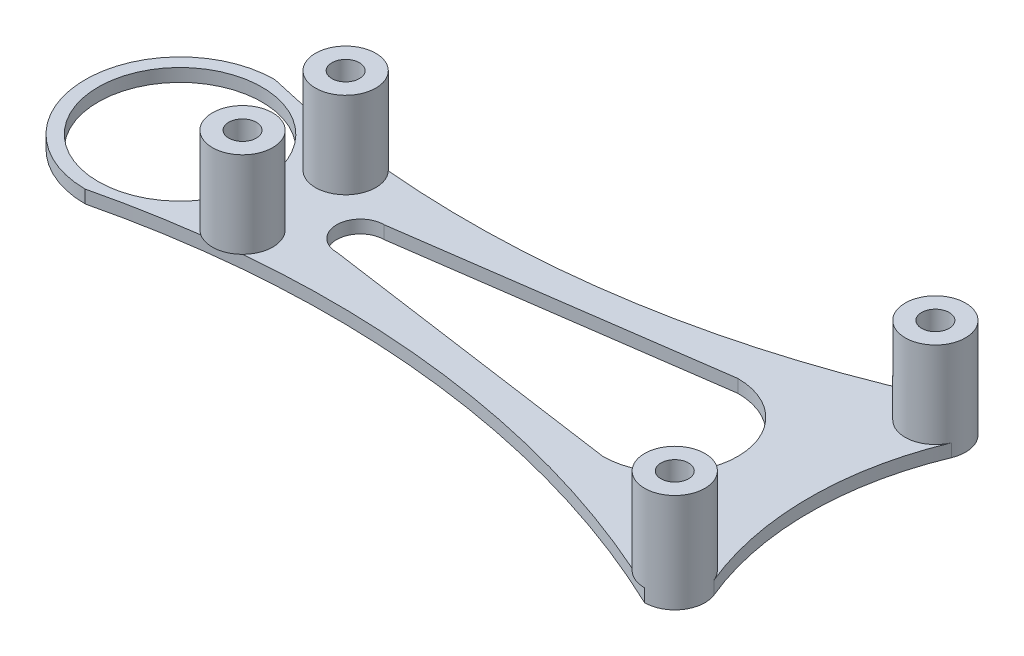
ISO-10303-21;
HEADER;
FILE_DESCRIPTION(('STEP AP214'),'2;1');
FILE_NAME('part.step','',(''),(''),'','','');
FILE_SCHEMA(('AUTOMOTIVE_DESIGN { 1 0 10303 214 1 1 1 1 }'));
ENDSEC;
DATA;
#1=APPLICATION_CONTEXT('core data for automotive mechanical design processes');
#2=APPLICATION_PROTOCOL_DEFINITION('international standard','automotive_design',2000,#1);
#3=PRODUCT_CONTEXT('',#1,'mechanical');
#4=PRODUCT('Part','Part','',(#3));
#5=PRODUCT_RELATED_PRODUCT_CATEGORY('part','',(#4));
#6=PRODUCT_DEFINITION_FORMATION('','',#4);
#7=PRODUCT_DEFINITION_CONTEXT('part definition',#1,'design');
#8=PRODUCT_DEFINITION('design','',#6,#7);
#9=PRODUCT_DEFINITION_SHAPE('','',#8);
#10=(LENGTH_UNIT() NAMED_UNIT(*) SI_UNIT(.MILLI.,.METRE.));
#11=(NAMED_UNIT(*) PLANE_ANGLE_UNIT() SI_UNIT($,.RADIAN.));
#12=(NAMED_UNIT(*) SI_UNIT($,.STERADIAN.) SOLID_ANGLE_UNIT());
#13=UNCERTAINTY_MEASURE_WITH_UNIT(LENGTH_MEASURE(1.E-05),#10,'distance_accuracy_value','');
#14=(GEOMETRIC_REPRESENTATION_CONTEXT(3) GLOBAL_UNCERTAINTY_ASSIGNED_CONTEXT((#13)) GLOBAL_UNIT_ASSIGNED_CONTEXT((#10,
#11,#12)) REPRESENTATION_CONTEXT('',''));
#15=CARTESIAN_POINT('',(0.,0.,0.));
#16=DIRECTION('',(0.,0.,1.));
#17=DIRECTION('',(1.,0.,0.));
#18=AXIS2_PLACEMENT_3D('',#15,#16,#17);
#19=CARTESIAN_POINT('',(-18.246620767098,0.75,7.55799778921041));
#20=DIRECTION('',(0.,1.,0.));
#21=DIRECTION('',(0.,0.,1.));
#22=AXIS2_PLACEMENT_3D('',#19,#20,#21);
#23=PLANE('',#22);
#24=CARTESIAN_POINT('',(-109.,0.75,0.));
#25=DIRECTION('',(0.,1.,0.));
#26=DIRECTION('',(0.,0.,1.));
#27=AXIS2_PLACEMENT_3D('',#24,#25,#26);
#28=CIRCLE('',#27,9.49999999999999);
#29=CARTESIAN_POINT('',(-109.,0.75,9.49999999999999));
#30=VERTEX_POINT('',#29);
#31=EDGE_CURVE('E253',#30,#30,#28,.T.);
#32=ORIENTED_EDGE('',*,*,#31,.F.);
#33=EDGE_LOOP('',(#32));
#34=FACE_BOUND('',#33,.T.);
#35=CARTESIAN_POINT('',(-88.0784459485142,0.75,0.));
#36=DIRECTION('',(0.,1.,0.));
#37=DIRECTION('',(0.,0.,1.));
#38=AXIS2_PLACEMENT_3D('',#35,#36,#37);
#39=CIRCLE('',#38,2.75757742414673);
#40=CARTESIAN_POINT('',(-88.0784459485142,0.75,-2.75757742414675));
#41=VERTEX_POINT('',#40);
#42=CARTESIAN_POINT('',(-88.0784459485142,0.75,2.75757742414671));
#43=VERTEX_POINT('',#42);
#44=EDGE_CURVE('E277',#41,#43,#39,.T.);
#45=ORIENTED_EDGE('',*,*,#44,.F.);
#46=DIRECTION('',(-0.990191024034519,0.,0.139720205845361));
#47=VECTOR('',#46,1.);
#48=CARTESIAN_POINT('',(-88.0784459485142,0.75,-2.75757742414675));
#49=LINE('',#48,#47);
#50=CARTESIAN_POINT('',(-52.1196363376409,0.75,-7.83151988457672));
#51=VERTEX_POINT('',#50);
#52=EDGE_CURVE('E264',#51,#41,#49,.T.);
#53=ORIENTED_EDGE('',*,*,#52,.F.);
#54=CARTESIAN_POINT('',(-52.1196363376409,0.75,0.));
#55=DIRECTION('',(0.,1.,0.));
#56=DIRECTION('',(0.,0.,1.));
#57=AXIS2_PLACEMENT_3D('',#54,#55,#56);
#58=CIRCLE('',#57,7.8315198845767);
#59=CARTESIAN_POINT('',(-52.1196363376409,0.75,7.83151988457668));
#60=VERTEX_POINT('',#59);
#61=EDGE_CURVE('E271',#60,#51,#58,.T.);
#62=ORIENTED_EDGE('',*,*,#61,.F.);
#63=DIRECTION('',(0.990191024034519,0.,0.139720205845361));
#64=VECTOR('',#63,1.);
#65=CARTESIAN_POINT('',(-88.0784459485142,0.75,2.75757742414671));
#66=LINE('',#65,#64);
#67=EDGE_CURVE('E274',#43,#60,#66,.T.);
#68=ORIENTED_EDGE('',*,*,#67,.F.);
#69=EDGE_LOOP('',(#45,#53,#62,#68));
#70=FACE_BOUND('',#69,.T.);
#71=CARTESIAN_POINT('',(-83.4775380681395,0.75,-116.969825596425));
#72=DIRECTION('',(0.,-1.,0.));
#73=DIRECTION('',(0.,0.,1.));
#74=AXIS2_PLACEMENT_3D('',#71,#72,#73);
#75=CIRCLE('',#74,109.);
#76=CARTESIAN_POINT('',(-39.1557309026529,0.75,-17.3878121121345));
#77=VERTEX_POINT('',#76);
#78=CARTESIAN_POINT('',(-93.2508303405097,0.75,-8.40886227093295));
#79=VERTEX_POINT('',#78);
#80=EDGE_CURVE('E138',#77,#79,#75,.T.);
#81=ORIENTED_EDGE('',*,*,#80,.T.);
#82=CARTESIAN_POINT('',(-95.79,0.75,-6.));
#83=DIRECTION('',(0.,1.,0.));
#84=DIRECTION('',(0.,0.,1.));
#85=AXIS2_PLACEMENT_3D('',#82,#83,#84);
#86=CIRCLE('',#85,3.50000000000001);
#87=CARTESIAN_POINT('',(-97.7393707773299,0.75,-8.90688038496468));
#88=VERTEX_POINT('',#87);
#89=EDGE_CURVE('E141',#88,#79,#86,.T.);
#90=ORIENTED_EDGE('',*,*,#89,.F.);
#91=CARTESIAN_POINT('',(-109.,0.75,-11.));
#92=VERTEX_POINT('',#91);
#93=EDGE_CURVE('E131',#88,#92,#75,.T.);
#94=ORIENTED_EDGE('',*,*,#93,.T.);
#95=CARTESIAN_POINT('',(-109.,0.75,0.));
#96=DIRECTION('',(0.,1.,0.));
#97=DIRECTION('',(0.,0.,1.));
#98=AXIS2_PLACEMENT_3D('',#95,#96,#97);
#99=CIRCLE('',#98,11.);
#100=CARTESIAN_POINT('',(-109.,0.75,11.));
#101=VERTEX_POINT('',#100);
#102=EDGE_CURVE('E236',#92,#101,#99,.T.);
#103=ORIENTED_EDGE('',*,*,#102,.T.);
#104=CARTESIAN_POINT('',(-83.4775380681395,0.75,116.969825596425));
#105=DIRECTION('',(0.,-1.,0.));
#106=DIRECTION('',(0.,0.,-1.));
#107=AXIS2_PLACEMENT_3D('',#104,#105,#106);
#108=CIRCLE('',#107,109.);
#109=CARTESIAN_POINT('',(-97.6887289545401,0.75,8.90020889686283));
#110=VERTEX_POINT('',#109);
#111=EDGE_CURVE('E219',#101,#110,#108,.T.);
#112=ORIENTED_EDGE('',*,*,#111,.T.);
#113=CARTESIAN_POINT('',(-95.79,0.75,5.96));
#114=DIRECTION('',(0.,1.,0.));
#115=DIRECTION('',(0.,0.,1.));
#116=AXIS2_PLACEMENT_3D('',#113,#114,#115);
#117=CIRCLE('',#116,3.50000000000001);
#118=CARTESIAN_POINT('',(-93.2931283109779,0.75,8.41267848862423));
#119=VERTEX_POINT('',#118);
#120=EDGE_CURVE('E164',#119,#110,#117,.T.);
#121=ORIENTED_EDGE('',*,*,#120,.F.);
#122=CARTESIAN_POINT('',(-39.1557309026526,0.75,17.3878121121346));
#123=VERTEX_POINT('',#122);
#124=EDGE_CURVE('E235',#119,#123,#108,.T.);
#125=ORIENTED_EDGE('',*,*,#124,.T.);
#126=CARTESIAN_POINT('',(-36.4932415341959,0.75,15.1159955784208));
#127=DIRECTION('',(0.,1.,0.));
#128=DIRECTION('',(0.,0.,1.));
#129=AXIS2_PLACEMENT_3D('',#126,#127,#128);
#130=CIRCLE('',#129,3.5);
#131=CARTESIAN_POINT('',(-33.2596631704064,0.75,13.776603565143));
#132=VERTEX_POINT('',#131);
#133=EDGE_CURVE('E176',#132,#123,#130,.T.);
#134=ORIENTED_EDGE('',*,*,#133,.F.);
#135=CARTESIAN_POINT('',(0.,0.75,0.));
#136=DIRECTION('',(0.,-1.,0.));
#137=DIRECTION('',(0.,0.,1.));
#138=AXIS2_PLACEMENT_3D('',#135,#136,#137);
#139=CIRCLE('',#138,36.);
#140=CARTESIAN_POINT('',(-33.2596631704064,0.75,-13.776603565143));
#141=VERTEX_POINT('',#140);
#142=EDGE_CURVE('E139',#132,#141,#139,.T.);
#143=ORIENTED_EDGE('',*,*,#142,.T.);
#144=CARTESIAN_POINT('',(-36.4932415341959,0.75,-15.1159955784208));
#145=DIRECTION('',(0.,1.,0.));
#146=DIRECTION('',(0.,0.,1.));
#147=AXIS2_PLACEMENT_3D('',#144,#145,#146);
#148=CIRCLE('',#147,3.5);
#149=EDGE_CURVE('E11',#77,#141,#148,.T.);
#150=ORIENTED_EDGE('',*,*,#149,.F.);
#151=EDGE_LOOP('',(#81,#90,#94,#103,#112,#121,#125,#134,#143,#150));
#152=FACE_BOUND('',#151,.T.);
#153=ADVANCED_FACE('F33',(#34,#70,#152),#23,.T.);
#154=CARTESIAN_POINT('',(-18.246620767098,-0.75,7.55799778921041));
#155=DIRECTION('',(0.,1.,0.));
#156=DIRECTION('',(0.,0.,1.));
#157=AXIS2_PLACEMENT_3D('',#154,#155,#156);
#158=PLANE('',#157);
#159=DIRECTION('',(0.990191024034519,0.,-0.139720205845361));
#160=VECTOR('',#159,1.);
#161=CARTESIAN_POINT('',(-88.0784459485142,-0.75,-2.75757742414675));
#162=LINE('',#161,#160);
#163=CARTESIAN_POINT('',(-88.0784459485142,-0.75,-2.75757742414675));
#164=VERTEX_POINT('',#163);
#165=CARTESIAN_POINT('',(-52.1196363376409,-0.75,-7.83151988457672));
#166=VERTEX_POINT('',#165);
#167=EDGE_CURVE('E281',#164,#166,#162,.T.);
#168=ORIENTED_EDGE('',*,*,#167,.F.);
#169=CARTESIAN_POINT('',(-88.0784459485142,-0.75,0.));
#170=DIRECTION('',(0.,1.,0.));
#171=DIRECTION('',(0.,0.,1.));
#172=AXIS2_PLACEMENT_3D('',#169,#170,#171);
#173=CIRCLE('',#172,2.75757742414673);
#174=CARTESIAN_POINT('',(-88.0784459485142,-0.75,2.75757742414671));
#175=VERTEX_POINT('',#174);
#176=EDGE_CURVE('E279',#175,#164,#173,.F.);
#177=ORIENTED_EDGE('',*,*,#176,.F.);
#178=DIRECTION('',(-0.990191024034519,0.,-0.139720205845361));
#179=VECTOR('',#178,1.);
#180=CARTESIAN_POINT('',(-88.0784459485142,-0.75,2.75757742414671));
#181=LINE('',#180,#179);
#182=CARTESIAN_POINT('',(-52.1196363376409,-0.75,7.83151988457668));
#183=VERTEX_POINT('',#182);
#184=EDGE_CURVE('E256',#183,#175,#181,.T.);
#185=ORIENTED_EDGE('',*,*,#184,.F.);
#186=CARTESIAN_POINT('',(-52.1196363376409,-0.75,0.));
#187=DIRECTION('',(0.,1.,0.));
#188=DIRECTION('',(0.,0.,1.));
#189=AXIS2_PLACEMENT_3D('',#186,#187,#188);
#190=CIRCLE('',#189,7.8315198845767);
#191=EDGE_CURVE('E188',#166,#183,#190,.F.);
#192=ORIENTED_EDGE('',*,*,#191,.F.);
#193=EDGE_LOOP('',(#168,#177,#185,#192));
#194=FACE_BOUND('',#193,.T.);
#195=CARTESIAN_POINT('',(-109.,-0.75,0.));
#196=DIRECTION('',(0.,1.,0.));
#197=DIRECTION('',(0.,0.,1.));
#198=AXIS2_PLACEMENT_3D('',#195,#196,#197);
#199=CIRCLE('',#198,9.49999999999999);
#200=CARTESIAN_POINT('',(-109.,-0.75,9.49999999999999));
#201=VERTEX_POINT('',#200);
#202=EDGE_CURVE('E250',#201,#201,#199,.F.);
#203=ORIENTED_EDGE('',*,*,#202,.F.);
#204=EDGE_LOOP('',(#203));
#205=FACE_BOUND('',#204,.T.);
#206=CARTESIAN_POINT('',(-95.79,-0.75,5.96));
#207=DIRECTION('',(0.,1.,0.));
#208=DIRECTION('',(0.,0.,1.));
#209=AXIS2_PLACEMENT_3D('',#206,#207,#208);
#210=CIRCLE('',#209,1.60000000000001);
#211=CARTESIAN_POINT('',(-95.79,-0.75,7.56));
#212=VERTEX_POINT('',#211);
#213=EDGE_CURVE('E244',#212,#212,#210,.T.);
#214=ORIENTED_EDGE('',*,*,#213,.T.);
#215=EDGE_LOOP('',(#214));
#216=FACE_BOUND('',#215,.T.);
#217=CARTESIAN_POINT('',(-36.4932415341959,-0.75,-15.1159955784208));
#218=DIRECTION('',(0.,1.,0.));
#219=DIRECTION('',(0.,0.,1.));
#220=AXIS2_PLACEMENT_3D('',#217,#218,#219);
#221=CIRCLE('',#220,1.6);
#222=CARTESIAN_POINT('',(-36.4932415341959,-0.75,-13.5159955784208));
#223=VERTEX_POINT('',#222);
#224=EDGE_CURVE('E233',#223,#223,#221,.T.);
#225=ORIENTED_EDGE('',*,*,#224,.T.);
#226=EDGE_LOOP('',(#225));
#227=FACE_BOUND('',#226,.T.);
#228=CARTESIAN_POINT('',(-36.4932415341959,-0.75,15.1159955784208));
#229=DIRECTION('',(0.,1.,0.));
#230=DIRECTION('',(0.,0.,1.));
#231=AXIS2_PLACEMENT_3D('',#228,#229,#230);
#232=CIRCLE('',#231,3.50000000000001);
#233=CARTESIAN_POINT('',(-36.4932415341959,-0.75,18.6159955784208));
#234=VERTEX_POINT('',#233);
#235=CARTESIAN_POINT('',(-33.2596631704064,-0.75,13.776603565143));
#236=VERTEX_POINT('',#235);
#237=EDGE_CURVE('E230',#234,#236,#232,.T.);
#238=ORIENTED_EDGE('',*,*,#237,.F.);
#239=CARTESIAN_POINT('',(-83.4775380681395,-0.75,116.969825596425));
#240=DIRECTION('',(0.,-1.,0.));
#241=DIRECTION('',(0.,0.,-1.));
#242=AXIS2_PLACEMENT_3D('',#239,#240,#241);
#243=CIRCLE('',#242,109.);
#244=CARTESIAN_POINT('',(-109.,-0.75,11.));
#245=VERTEX_POINT('',#244);
#246=EDGE_CURVE('E220',#245,#234,#243,.T.);
#247=ORIENTED_EDGE('',*,*,#246,.F.);
#248=CARTESIAN_POINT('',(-109.,-0.75,0.));
#249=DIRECTION('',(0.,1.,0.));
#250=DIRECTION('',(0.,0.,1.));
#251=AXIS2_PLACEMENT_3D('',#248,#249,#250);
#252=CIRCLE('',#251,11.);
#253=CARTESIAN_POINT('',(-109.,-0.75,-11.));
#254=VERTEX_POINT('',#253);
#255=EDGE_CURVE('E222',#254,#245,#252,.T.);
#256=ORIENTED_EDGE('',*,*,#255,.F.);
#257=CARTESIAN_POINT('',(-83.4775380681395,-0.75,-116.969825596425));
#258=DIRECTION('',(0.,-1.,0.));
#259=DIRECTION('',(0.,0.,1.));
#260=AXIS2_PLACEMENT_3D('',#257,#258,#259);
#261=CIRCLE('',#260,109.);
#262=CARTESIAN_POINT('',(-36.4932415341959,-0.75,-18.6159955784208));
#263=VERTEX_POINT('',#262);
#264=EDGE_CURVE('E224',#263,#254,#261,.T.);
#265=ORIENTED_EDGE('',*,*,#264,.F.);
#266=CARTESIAN_POINT('',(-36.4932415341959,-0.75,-15.1159955784208));
#267=DIRECTION('',(0.,1.,0.));
#268=DIRECTION('',(0.,0.,1.));
#269=AXIS2_PLACEMENT_3D('',#266,#267,#268);
#270=CIRCLE('',#269,3.5);
#271=CARTESIAN_POINT('',(-33.2596631704064,-0.75,-13.776603565143));
#272=VERTEX_POINT('',#271);
#273=EDGE_CURVE('E226',#272,#263,#270,.T.);
#274=ORIENTED_EDGE('',*,*,#273,.F.);
#275=CARTESIAN_POINT('',(0.,-0.75,0.));
#276=DIRECTION('',(0.,-1.,0.));
#277=DIRECTION('',(0.,0.,1.));
#278=AXIS2_PLACEMENT_3D('',#275,#276,#277);
#279=CIRCLE('',#278,36.);
#280=EDGE_CURVE('E228',#236,#272,#279,.T.);
#281=ORIENTED_EDGE('',*,*,#280,.F.);
#282=EDGE_LOOP('',(#238,#247,#256,#265,#274,#281));
#283=FACE_BOUND('',#282,.T.);
#284=CARTESIAN_POINT('',(-36.4932415341959,-0.75,15.1159955784208));
#285=DIRECTION('',(0.,1.,0.));
#286=DIRECTION('',(0.,0.,1.));
#287=AXIS2_PLACEMENT_3D('',#284,#285,#286);
#288=CIRCLE('',#287,1.6);
#289=CARTESIAN_POINT('',(-36.4932415341959,-0.75,16.7159955784208));
#290=VERTEX_POINT('',#289);
#291=EDGE_CURVE('E241',#290,#290,#288,.T.);
#292=ORIENTED_EDGE('',*,*,#291,.T.);
#293=EDGE_LOOP('',(#292));
#294=FACE_BOUND('',#293,.T.);
#295=CARTESIAN_POINT('',(-95.79,-0.75,-6.));
#296=DIRECTION('',(0.,1.,0.));
#297=DIRECTION('',(0.,0.,1.));
#298=AXIS2_PLACEMENT_3D('',#295,#296,#297);
#299=CIRCLE('',#298,1.60000000000001);
#300=CARTESIAN_POINT('',(-95.79,-0.75,-4.4));
#301=VERTEX_POINT('',#300);
#302=EDGE_CURVE('E247',#301,#301,#299,.T.);
#303=ORIENTED_EDGE('',*,*,#302,.T.);
#304=EDGE_LOOP('',(#303));
#305=FACE_BOUND('',#304,.T.);
#306=ADVANCED_FACE('F296',(#194,#205,#216,#227,#283,#294,#305),#158,.F.);
#307=CARTESIAN_POINT('',(-36.4932415341959,0.75,15.1159955784208));
#308=DIRECTION('',(0.,-1.,0.));
#309=DIRECTION('',(0.,0.,-1.));
#310=AXIS2_PLACEMENT_3D('',#307,#308,#309);
#311=CYLINDRICAL_SURFACE('',#310,3.50000000000001);
#312=ORIENTED_EDGE('',*,*,#237,.T.);
#313=DIRECTION('',(0.,-1.,0.));
#314=VECTOR('',#313,1.);
#315=CARTESIAN_POINT('',(-33.2596631704064,0.75,13.776603565143));
#316=LINE('',#315,#314);
#317=EDGE_CURVE('E43',#132,#236,#316,.T.);
#318=ORIENTED_EDGE('',*,*,#317,.F.);
#319=ORIENTED_EDGE('',*,*,#133,.T.);
#320=CARTESIAN_POINT('',(-36.4932415341959,0.75,18.6159955784208));
#321=VERTEX_POINT('',#320);
#322=EDGE_CURVE('E171',#123,#321,#130,.T.);
#323=ORIENTED_EDGE('',*,*,#322,.T.);
#324=DIRECTION('',(0.,-1.,0.));
#325=VECTOR('',#324,1.);
#326=CARTESIAN_POINT('',(-36.4932415341959,0.75,18.6159955784208));
#327=LINE('',#326,#325);
#328=EDGE_CURVE('E214',#321,#234,#327,.T.);
#329=ORIENTED_EDGE('',*,*,#328,.T.);
#330=EDGE_LOOP('',(#312,#318,#319,#323,#329));
#331=FACE_BOUND('',#330,.T.);
#332=CARTESIAN_POINT('',(-36.4932415341959,10.75,15.1159955784208));
#333=DIRECTION('',(0.,1.,0.));
#334=DIRECTION('',(0.,0.,1.));
#335=AXIS2_PLACEMENT_3D('',#332,#333,#334);
#336=CIRCLE('',#335,3.5);
#337=CARTESIAN_POINT('',(-36.4932415341959,10.75,18.6159955784208));
#338=VERTEX_POINT('',#337);
#339=EDGE_CURVE('E172',#338,#338,#336,.T.);
#340=ORIENTED_EDGE('',*,*,#339,.F.);
#341=EDGE_LOOP('',(#340));
#342=FACE_BOUND('',#341,.T.);
#343=ADVANCED_FACE('F35',(#331,#342),#311,.T.);
#344=CARTESIAN_POINT('',(0.,0.75,0.));
#345=DIRECTION('',(0.,-1.,0.));
#346=DIRECTION('',(0.,0.,-1.));
#347=AXIS2_PLACEMENT_3D('',#344,#345,#346);
#348=CYLINDRICAL_SURFACE('',#347,36.);
#349=ORIENTED_EDGE('',*,*,#280,.T.);
#350=DIRECTION('',(0.,-1.,0.));
#351=VECTOR('',#350,1.);
#352=CARTESIAN_POINT('',(-33.2596631704064,0.75,-13.776603565143));
#353=LINE('',#352,#351);
#354=EDGE_CURVE('E197',#141,#272,#353,.T.);
#355=ORIENTED_EDGE('',*,*,#354,.F.);
#356=ORIENTED_EDGE('',*,*,#142,.F.);
#357=ORIENTED_EDGE('',*,*,#317,.T.);
#358=EDGE_LOOP('',(#349,#355,#356,#357));
#359=FACE_BOUND('',#358,.T.);
#360=ADVANCED_FACE('F338',(#359),#348,.F.);
#361=CARTESIAN_POINT('',(-36.4932415341959,0.75,-15.1159955784208));
#362=DIRECTION('',(0.,-1.,0.));
#363=DIRECTION('',(0.,0.,-1.));
#364=AXIS2_PLACEMENT_3D('',#361,#362,#363);
#365=CYLINDRICAL_SURFACE('',#364,3.5);
#366=ORIENTED_EDGE('',*,*,#273,.T.);
#367=DIRECTION('',(0.,-1.,0.));
#368=VECTOR('',#367,1.);
#369=CARTESIAN_POINT('',(-36.4932415341959,0.75,-18.6159955784208));
#370=LINE('',#369,#368);
#371=CARTESIAN_POINT('',(-36.4932415341959,0.75,-18.6159955784208));
#372=VERTEX_POINT('',#371);
#373=EDGE_CURVE('E204',#372,#263,#370,.T.);
#374=ORIENTED_EDGE('',*,*,#373,.F.);
#375=EDGE_CURVE('E184',#372,#77,#148,.T.);
#376=ORIENTED_EDGE('',*,*,#375,.T.);
#377=ORIENTED_EDGE('',*,*,#149,.T.);
#378=ORIENTED_EDGE('',*,*,#354,.T.);
#379=EDGE_LOOP('',(#366,#374,#376,#377,#378));
#380=FACE_BOUND('',#379,.T.);
#381=CARTESIAN_POINT('',(-36.4932415341959,10.75,-15.1159955784208));
#382=DIRECTION('',(0.,1.,0.));
#383=DIRECTION('',(0.,0.,1.));
#384=AXIS2_PLACEMENT_3D('',#381,#382,#383);
#385=CIRCLE('',#384,3.5);
#386=CARTESIAN_POINT('',(-36.4932415341959,10.75,-11.6159955784208));
#387=VERTEX_POINT('',#386);
#388=EDGE_CURVE('E185',#387,#387,#385,.T.);
#389=ORIENTED_EDGE('',*,*,#388,.F.);
#390=EDGE_LOOP('',(#389));
#391=FACE_BOUND('',#390,.T.);
#392=ADVANCED_FACE('F336',(#380,#391),#365,.T.);
#393=CARTESIAN_POINT('',(-83.4775380681395,0.75,-116.969825596425));
#394=DIRECTION('',(0.,-1.,0.));
#395=DIRECTION('',(0.,0.,-1.));
#396=AXIS2_PLACEMENT_3D('',#393,#394,#395);
#397=CYLINDRICAL_SURFACE('',#396,109.);
#398=ORIENTED_EDGE('',*,*,#264,.T.);
#399=DIRECTION('',(0.,-1.,0.));
#400=VECTOR('',#399,1.);
#401=CARTESIAN_POINT('',(-109.,0.75,-11.));
#402=LINE('',#401,#400);
#403=EDGE_CURVE('E135',#92,#254,#402,.T.);
#404=ORIENTED_EDGE('',*,*,#403,.F.);
#405=ORIENTED_EDGE('',*,*,#93,.F.);
#406=CARTESIAN_POINT('',(-83.4775380681395,0.75,-116.969825596425));
#407=DIRECTION('',(0.,1.,0.));
#408=DIRECTION('',(0.,0.,1.));
#409=AXIS2_PLACEMENT_3D('',#406,#407,#408);
#410=CIRCLE('',#409,109.);
#411=EDGE_CURVE('E51',#79,#88,#410,.F.);
#412=ORIENTED_EDGE('',*,*,#411,.F.);
#413=ORIENTED_EDGE('',*,*,#80,.F.);
#414=EDGE_CURVE('E37',#372,#77,#75,.T.);
#415=ORIENTED_EDGE('',*,*,#414,.F.);
#416=ORIENTED_EDGE('',*,*,#373,.T.);
#417=EDGE_LOOP('',(#398,#404,#405,#412,#413,#415,#416));
#418=FACE_BOUND('',#417,.T.);
#419=ADVANCED_FACE('F133',(#418),#397,.F.);
#420=CARTESIAN_POINT('',(-109.,0.75,0.));
#421=DIRECTION('',(0.,-1.,0.));
#422=DIRECTION('',(0.,0.,-1.));
#423=AXIS2_PLACEMENT_3D('',#420,#421,#422);
#424=CYLINDRICAL_SURFACE('',#423,11.);
#425=ORIENTED_EDGE('',*,*,#255,.T.);
#426=DIRECTION('',(0.,-1.,0.));
#427=VECTOR('',#426,1.);
#428=CARTESIAN_POINT('',(-109.,0.75,11.));
#429=LINE('',#428,#427);
#430=EDGE_CURVE('E210',#101,#245,#429,.T.);
#431=ORIENTED_EDGE('',*,*,#430,.F.);
#432=ORIENTED_EDGE('',*,*,#102,.F.);
#433=ORIENTED_EDGE('',*,*,#403,.T.);
#434=EDGE_LOOP('',(#425,#431,#432,#433));
#435=FACE_BOUND('',#434,.T.);
#436=ADVANCED_FACE('F331',(#435),#424,.T.);
#437=CARTESIAN_POINT('',(-83.4775380681395,0.75,116.969825596425));
#438=DIRECTION('',(0.,-1.,0.));
#439=DIRECTION('',(0.,0.,-1.));
#440=AXIS2_PLACEMENT_3D('',#437,#438,#439);
#441=CYLINDRICAL_SURFACE('',#440,109.);
#442=ORIENTED_EDGE('',*,*,#246,.T.);
#443=ORIENTED_EDGE('',*,*,#328,.F.);
#444=CARTESIAN_POINT('',(-83.4775380681395,0.75,116.969825596425));
#445=DIRECTION('',(0.,1.,0.));
#446=DIRECTION('',(0.,0.,1.));
#447=AXIS2_PLACEMENT_3D('',#444,#445,#446);
#448=CIRCLE('',#447,109.);
#449=EDGE_CURVE('E175',#123,#321,#448,.F.);
#450=ORIENTED_EDGE('',*,*,#449,.F.);
#451=ORIENTED_EDGE('',*,*,#124,.F.);
#452=CARTESIAN_POINT('',(-83.4775380681395,0.75,116.969825596425));
#453=DIRECTION('',(0.,1.,0.));
#454=DIRECTION('',(0.,0.,1.));
#455=AXIS2_PLACEMENT_3D('',#452,#453,#454);
#456=CIRCLE('',#455,109.);
#457=EDGE_CURVE('E59',#110,#119,#456,.F.);
#458=ORIENTED_EDGE('',*,*,#457,.F.);
#459=ORIENTED_EDGE('',*,*,#111,.F.);
#460=ORIENTED_EDGE('',*,*,#430,.T.);
#461=EDGE_LOOP('',(#442,#443,#450,#451,#458,#459,#460));
#462=FACE_BOUND('',#461,.T.);
#463=ADVANCED_FACE('F328',(#462),#441,.F.);
#464=CARTESIAN_POINT('',(-36.4932415341959,0.75,-15.1159955784208));
#465=DIRECTION('',(0.,-1.,0.));
#466=DIRECTION('',(0.,0.,-1.));
#467=AXIS2_PLACEMENT_3D('',#464,#465,#466);
#468=CYLINDRICAL_SURFACE('',#467,1.6);
#469=ORIENTED_EDGE('',*,*,#224,.F.);
#470=EDGE_LOOP('',(#469));
#471=FACE_BOUND('',#470,.T.);
#472=CARTESIAN_POINT('',(-36.4932415341959,10.75,-15.1159955784208));
#473=DIRECTION('',(0.,1.,0.));
#474=DIRECTION('',(0.,0.,1.));
#475=AXIS2_PLACEMENT_3D('',#472,#473,#474);
#476=CIRCLE('',#475,1.6);
#477=CARTESIAN_POINT('',(-36.4932415341959,10.75,-13.5159955784208));
#478=VERTEX_POINT('',#477);
#479=EDGE_CURVE('E181',#478,#478,#476,.T.);
#480=ORIENTED_EDGE('',*,*,#479,.T.);
#481=EDGE_LOOP('',(#480));
#482=FACE_BOUND('',#481,.T.);
#483=ADVANCED_FACE('F325',(#471,#482),#468,.F.);
#484=CARTESIAN_POINT('',(-36.4932415341959,0.75,15.1159955784208));
#485=DIRECTION('',(0.,-1.,0.));
#486=DIRECTION('',(0.,0.,-1.));
#487=AXIS2_PLACEMENT_3D('',#484,#485,#486);
#488=CYLINDRICAL_SURFACE('',#487,1.6);
#489=ORIENTED_EDGE('',*,*,#291,.F.);
#490=EDGE_LOOP('',(#489));
#491=FACE_BOUND('',#490,.T.);
#492=CARTESIAN_POINT('',(-36.4932415341959,10.75,15.1159955784208));
#493=DIRECTION('',(0.,1.,0.));
#494=DIRECTION('',(0.,0.,1.));
#495=AXIS2_PLACEMENT_3D('',#492,#493,#494);
#496=CIRCLE('',#495,1.6);
#497=CARTESIAN_POINT('',(-36.4932415341959,10.75,16.7159955784208));
#498=VERTEX_POINT('',#497);
#499=EDGE_CURVE('E168',#498,#498,#496,.T.);
#500=ORIENTED_EDGE('',*,*,#499,.T.);
#501=EDGE_LOOP('',(#500));
#502=FACE_BOUND('',#501,.T.);
#503=ADVANCED_FACE('F412',(#491,#502),#488,.F.);
#504=CARTESIAN_POINT('',(-95.79,0.75,5.96));
#505=DIRECTION('',(0.,-1.,0.));
#506=DIRECTION('',(0.,0.,-1.));
#507=AXIS2_PLACEMENT_3D('',#504,#505,#506);
#508=CYLINDRICAL_SURFACE('',#507,1.60000000000001);
#509=ORIENTED_EDGE('',*,*,#213,.F.);
#510=EDGE_LOOP('',(#509));
#511=FACE_BOUND('',#510,.T.);
#512=CARTESIAN_POINT('',(-95.79,10.75,5.96));
#513=DIRECTION('',(0.,1.,0.));
#514=DIRECTION('',(0.,0.,1.));
#515=AXIS2_PLACEMENT_3D('',#512,#513,#514);
#516=CIRCLE('',#515,1.60000000000001);
#517=CARTESIAN_POINT('',(-95.79,10.75,7.56000000000001));
#518=VERTEX_POINT('',#517);
#519=EDGE_CURVE('E150',#518,#518,#516,.T.);
#520=ORIENTED_EDGE('',*,*,#519,.T.);
#521=EDGE_LOOP('',(#520));
#522=FACE_BOUND('',#521,.T.);
#523=ADVANCED_FACE('F409',(#511,#522),#508,.F.);
#524=CARTESIAN_POINT('',(-95.79,0.75,-6.));
#525=DIRECTION('',(0.,-1.,0.));
#526=DIRECTION('',(0.,0.,-1.));
#527=AXIS2_PLACEMENT_3D('',#524,#525,#526);
#528=CYLINDRICAL_SURFACE('',#527,1.60000000000001);
#529=ORIENTED_EDGE('',*,*,#302,.F.);
#530=EDGE_LOOP('',(#529));
#531=FACE_BOUND('',#530,.T.);
#532=CARTESIAN_POINT('',(-95.79,10.75,-6.));
#533=DIRECTION('',(0.,1.,0.));
#534=DIRECTION('',(0.,0.,1.));
#535=AXIS2_PLACEMENT_3D('',#532,#533,#534);
#536=CIRCLE('',#535,1.60000000000001);
#537=CARTESIAN_POINT('',(-95.79,10.75,-4.4));
#538=VERTEX_POINT('',#537);
#539=EDGE_CURVE('E146',#538,#538,#536,.T.);
#540=ORIENTED_EDGE('',*,*,#539,.T.);
#541=EDGE_LOOP('',(#540));
#542=FACE_BOUND('',#541,.T.);
#543=ADVANCED_FACE('F406',(#531,#542),#528,.F.);
#544=CARTESIAN_POINT('',(-109.,-0.751,0.));
#545=DIRECTION('',(0.,1.,0.));
#546=DIRECTION('',(0.,0.,1.));
#547=AXIS2_PLACEMENT_3D('',#544,#545,#546);
#548=CYLINDRICAL_SURFACE('',#547,9.49999999999999);
#549=ORIENTED_EDGE('',*,*,#31,.T.);
#550=EDGE_LOOP('',(#549));
#551=FACE_BOUND('',#550,.T.);
#552=ORIENTED_EDGE('',*,*,#202,.T.);
#553=EDGE_LOOP('',(#552));
#554=FACE_BOUND('',#553,.T.);
#555=ADVANCED_FACE('F311',(#551,#554),#548,.F.);
#556=CARTESIAN_POINT('',(-88.0784459485142,-0.751,0.));
#557=DIRECTION('',(0.,1.,0.));
#558=DIRECTION('',(0.,0.,1.));
#559=AXIS2_PLACEMENT_3D('',#556,#557,#558);
#560=CYLINDRICAL_SURFACE('',#559,2.75757742414673);
#561=ORIENTED_EDGE('',*,*,#176,.T.);
#562=DIRECTION('',(0.,1.,0.));
#563=VECTOR('',#562,1.);
#564=CARTESIAN_POINT('',(-88.0784459485142,-0.751,-2.75757742414675));
#565=LINE('',#564,#563);
#566=EDGE_CURVE('E259',#164,#41,#565,.T.);
#567=ORIENTED_EDGE('',*,*,#566,.T.);
#568=ORIENTED_EDGE('',*,*,#44,.T.);
#569=DIRECTION('',(0.,1.,0.));
#570=VECTOR('',#569,1.);
#571=CARTESIAN_POINT('',(-88.0784459485142,-0.751,2.75757742414671));
#572=LINE('',#571,#570);
#573=EDGE_CURVE('E260',#175,#43,#572,.T.);
#574=ORIENTED_EDGE('',*,*,#573,.F.);
#575=EDGE_LOOP('',(#561,#567,#568,#574));
#576=FACE_BOUND('',#575,.T.);
#577=ADVANCED_FACE('F299',(#576),#560,.F.);
#578=CARTESIAN_POINT('',(-88.0784459485142,-0.751,-2.75757742414675));
#579=DIRECTION('',(-0.139720205845361,0.,-0.990191024034519));
#580=DIRECTION('',(-0.990191024034519,0.,0.139720205845361));
#581=AXIS2_PLACEMENT_3D('',#578,#579,#580);
#582=PLANE('',#581);
#583=ORIENTED_EDGE('',*,*,#167,.T.);
#584=DIRECTION('',(0.,1.,0.));
#585=VECTOR('',#584,1.);
#586=CARTESIAN_POINT('',(-52.1196363376409,-0.751,-7.83151988457672));
#587=LINE('',#586,#585);
#588=EDGE_CURVE('E266',#166,#51,#587,.T.);
#589=ORIENTED_EDGE('',*,*,#588,.T.);
#590=ORIENTED_EDGE('',*,*,#52,.T.);
#591=ORIENTED_EDGE('',*,*,#566,.F.);
#592=EDGE_LOOP('',(#583,#589,#590,#591));
#593=FACE_BOUND('',#592,.T.);
#594=ADVANCED_FACE('F303',(#593),#582,.F.);
#595=CARTESIAN_POINT('',(-52.1196363376409,-0.751,0.));
#596=DIRECTION('',(0.,1.,0.));
#597=DIRECTION('',(0.,0.,1.));
#598=AXIS2_PLACEMENT_3D('',#595,#596,#597);
#599=CYLINDRICAL_SURFACE('',#598,7.8315198845767);
#600=ORIENTED_EDGE('',*,*,#191,.T.);
#601=DIRECTION('',(0.,1.,0.));
#602=VECTOR('',#601,1.);
#603=CARTESIAN_POINT('',(-52.1196363376409,-0.751,7.83151988457668));
#604=LINE('',#603,#602);
#605=EDGE_CURVE('E263',#183,#60,#604,.T.);
#606=ORIENTED_EDGE('',*,*,#605,.T.);
#607=ORIENTED_EDGE('',*,*,#61,.T.);
#608=ORIENTED_EDGE('',*,*,#588,.F.);
#609=EDGE_LOOP('',(#600,#606,#607,#608));
#610=FACE_BOUND('',#609,.T.);
#611=ADVANCED_FACE('F288',(#610),#599,.F.);
#612=CARTESIAN_POINT('',(-88.0784459485142,-0.751,2.75757742414671));
#613=DIRECTION('',(-0.139720205845361,0.,0.990191024034519));
#614=DIRECTION('',(0.990191024034519,0.,0.139720205845361));
#615=AXIS2_PLACEMENT_3D('',#612,#613,#614);
#616=PLANE('',#615);
#617=ORIENTED_EDGE('',*,*,#184,.T.);
#618=ORIENTED_EDGE('',*,*,#573,.T.);
#619=ORIENTED_EDGE('',*,*,#67,.T.);
#620=ORIENTED_EDGE('',*,*,#605,.F.);
#621=EDGE_LOOP('',(#617,#618,#619,#620));
#622=FACE_BOUND('',#621,.T.);
#623=ADVANCED_FACE('F292',(#622),#616,.F.);
#624=CARTESIAN_POINT('',(-36.4932415341959,0.75,-15.1159955784208));
#625=DIRECTION('',(0.,1.,0.));
#626=DIRECTION('',(0.,0.,1.));
#627=AXIS2_PLACEMENT_3D('',#624,#625,#626);
#628=PLANE('',#627);
#629=ORIENTED_EDGE('',*,*,#375,.F.);
#630=ORIENTED_EDGE('',*,*,#414,.T.);
#631=EDGE_LOOP('',(#629,#630));
#632=FACE_BOUND('',#631,.T.);
#633=ADVANCED_FACE('F390',(#632),#628,.F.);
#634=CARTESIAN_POINT('',(-36.4932415341959,10.75,-15.1159955784208));
#635=DIRECTION('',(0.,1.,0.));
#636=DIRECTION('',(0.,0.,1.));
#637=AXIS2_PLACEMENT_3D('',#634,#635,#636);
#638=PLANE('',#637);
#639=ORIENTED_EDGE('',*,*,#388,.T.);
#640=EDGE_LOOP('',(#639));
#641=FACE_BOUND('',#640,.T.);
#642=ORIENTED_EDGE('',*,*,#479,.F.);
#643=EDGE_LOOP('',(#642));
#644=FACE_BOUND('',#643,.T.);
#645=ADVANCED_FACE('F387',(#641,#644),#638,.T.);
#646=CARTESIAN_POINT('',(-36.4932415341959,0.75,15.1159955784208));
#647=DIRECTION('',(0.,1.,0.));
#648=DIRECTION('',(0.,0.,1.));
#649=AXIS2_PLACEMENT_3D('',#646,#647,#648);
#650=PLANE('',#649);
#651=ORIENTED_EDGE('',*,*,#322,.F.);
#652=ORIENTED_EDGE('',*,*,#449,.T.);
#653=EDGE_LOOP('',(#651,#652));
#654=FACE_BOUND('',#653,.T.);
#655=ADVANCED_FACE('F383',(#654),#650,.F.);
#656=CARTESIAN_POINT('',(-36.4932415341959,10.75,15.1159955784208));
#657=DIRECTION('',(0.,1.,0.));
#658=DIRECTION('',(0.,0.,1.));
#659=AXIS2_PLACEMENT_3D('',#656,#657,#658);
#660=PLANE('',#659);
#661=ORIENTED_EDGE('',*,*,#339,.T.);
#662=EDGE_LOOP('',(#661));
#663=FACE_BOUND('',#662,.T.);
#664=ORIENTED_EDGE('',*,*,#499,.F.);
#665=EDGE_LOOP('',(#664));
#666=FACE_BOUND('',#665,.T.);
#667=ADVANCED_FACE('F380',(#663,#666),#660,.T.);
#668=CARTESIAN_POINT('',(-95.79,0.75,5.96));
#669=DIRECTION('',(0.,1.,0.));
#670=DIRECTION('',(0.,0.,1.));
#671=AXIS2_PLACEMENT_3D('',#668,#669,#670);
#672=PLANE('',#671);
#673=EDGE_CURVE('E160',#110,#119,#117,.T.);
#674=ORIENTED_EDGE('',*,*,#673,.F.);
#675=ORIENTED_EDGE('',*,*,#457,.T.);
#676=EDGE_LOOP('',(#674,#675));
#677=FACE_BOUND('',#676,.T.);
#678=ADVANCED_FACE('F362',(#677),#672,.F.);
#679=CARTESIAN_POINT('',(-95.79,10.75,5.96));
#680=DIRECTION('',(0.,1.,0.));
#681=DIRECTION('',(0.,0.,1.));
#682=AXIS2_PLACEMENT_3D('',#679,#680,#681);
#683=PLANE('',#682);
#684=CARTESIAN_POINT('',(-95.79,10.75,5.96));
#685=DIRECTION('',(0.,1.,0.));
#686=DIRECTION('',(0.,0.,1.));
#687=AXIS2_PLACEMENT_3D('',#684,#685,#686);
#688=CIRCLE('',#687,3.50000000000001);
#689=CARTESIAN_POINT('',(-95.79,10.75,9.46000000000001));
#690=VERTEX_POINT('',#689);
#691=EDGE_CURVE('E161',#690,#690,#688,.T.);
#692=ORIENTED_EDGE('',*,*,#691,.T.);
#693=EDGE_LOOP('',(#692));
#694=FACE_BOUND('',#693,.T.);
#695=ORIENTED_EDGE('',*,*,#519,.F.);
#696=EDGE_LOOP('',(#695));
#697=FACE_BOUND('',#696,.T.);
#698=ADVANCED_FACE('F366',(#694,#697),#683,.T.);
#699=CARTESIAN_POINT('',(-95.79,10.75,5.96));
#700=DIRECTION('',(0.,-1.,0.));
#701=DIRECTION('',(0.,0.,-1.));
#702=AXIS2_PLACEMENT_3D('',#699,#700,#701);
#703=CYLINDRICAL_SURFACE('',#702,3.50000000000001);
#704=ORIENTED_EDGE('',*,*,#691,.F.);
#705=EDGE_LOOP('',(#704));
#706=FACE_BOUND('',#705,.T.);
#707=ORIENTED_EDGE('',*,*,#120,.T.);
#708=ORIENTED_EDGE('',*,*,#673,.T.);
#709=EDGE_LOOP('',(#707,#708));
#710=FACE_BOUND('',#709,.T.);
#711=ADVANCED_FACE('F364',(#706,#710),#703,.T.);
#712=CARTESIAN_POINT('',(-95.79,0.75,-6.));
#713=DIRECTION('',(0.,1.,0.));
#714=DIRECTION('',(0.,0.,1.));
#715=AXIS2_PLACEMENT_3D('',#712,#713,#714);
#716=PLANE('',#715);
#717=EDGE_CURVE('E145',#79,#88,#86,.T.);
#718=ORIENTED_EDGE('',*,*,#717,.F.);
#719=ORIENTED_EDGE('',*,*,#411,.T.);
#720=EDGE_LOOP('',(#718,#719));
#721=FACE_BOUND('',#720,.T.);
#722=ADVANCED_FACE('F149',(#721),#716,.F.);
#723=CARTESIAN_POINT('',(-95.79,10.75,-6.));
#724=DIRECTION('',(0.,1.,0.));
#725=DIRECTION('',(0.,0.,1.));
#726=AXIS2_PLACEMENT_3D('',#723,#724,#725);
#727=PLANE('',#726);
#728=CARTESIAN_POINT('',(-95.79,10.75,-6.));
#729=DIRECTION('',(0.,1.,0.));
#730=DIRECTION('',(0.,0.,1.));
#731=AXIS2_PLACEMENT_3D('',#728,#729,#730);
#732=CIRCLE('',#731,3.50000000000001);
#733=CARTESIAN_POINT('',(-95.79,10.75,-2.49999999999999));
#734=VERTEX_POINT('',#733);
#735=EDGE_CURVE('E151',#734,#734,#732,.T.);
#736=ORIENTED_EDGE('',*,*,#735,.T.);
#737=EDGE_LOOP('',(#736));
#738=FACE_BOUND('',#737,.T.);
#739=ORIENTED_EDGE('',*,*,#539,.F.);
#740=EDGE_LOOP('',(#739));
#741=FACE_BOUND('',#740,.T.);
#742=ADVANCED_FACE('F373',(#738,#741),#727,.T.);
#743=CARTESIAN_POINT('',(-95.79,10.75,-6.));
#744=DIRECTION('',(0.,-1.,0.));
#745=DIRECTION('',(0.,0.,-1.));
#746=AXIS2_PLACEMENT_3D('',#743,#744,#745);
#747=CYLINDRICAL_SURFACE('',#746,3.50000000000001);
#748=ORIENTED_EDGE('',*,*,#735,.F.);
#749=EDGE_LOOP('',(#748));
#750=FACE_BOUND('',#749,.T.);
#751=ORIENTED_EDGE('',*,*,#717,.T.);
#752=ORIENTED_EDGE('',*,*,#89,.T.);
#753=EDGE_LOOP('',(#751,#752));
#754=FACE_BOUND('',#753,.T.);
#755=ADVANCED_FACE('F153',(#750,#754),#747,.T.);
#756=CLOSED_SHELL('',(#153,#306,#343,#360,#392,#419,#436,#463,#483,#503,#523,#543,#555,#577,
#594,#611,#623,#633,#645,#655,#667,#678,#698,#711,#722,#742,#755));
#757=MANIFOLD_SOLID_BREP('B2',#756);
#758=ADVANCED_BREP_SHAPE_REPRESENTATION('',(#18,#757),#14);
#759=SHAPE_DEFINITION_REPRESENTATION(#9,#758);
ENDSEC;
END-ISO-10303-21;
